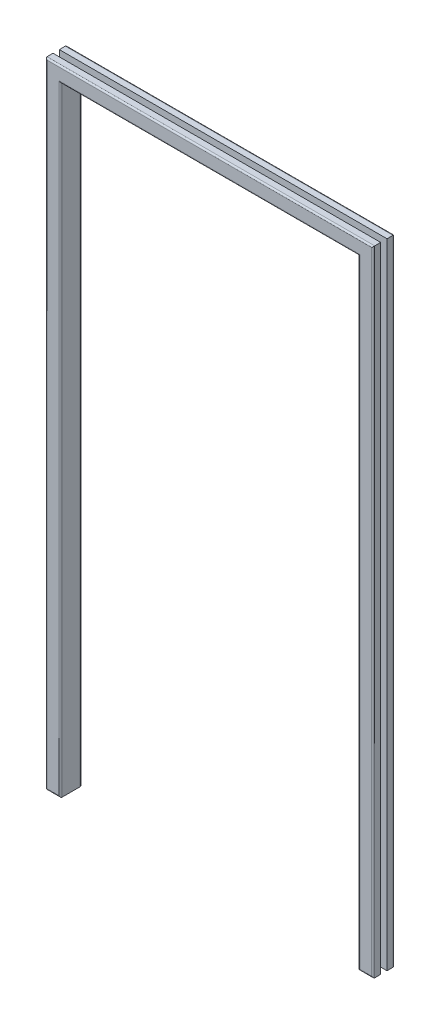
ISO-10303-21;
HEADER;
FILE_DESCRIPTION(('STEP AP214'),'2;1');
FILE_NAME('part.step','',(''),(''),'','','');
FILE_SCHEMA(('AUTOMOTIVE_DESIGN { 1 0 10303 214 1 1 1 1 }'));
ENDSEC;
DATA;
#1=APPLICATION_CONTEXT('core data for automotive mechanical design processes');
#2=APPLICATION_PROTOCOL_DEFINITION('international standard','automotive_design',2000,#1);
#3=PRODUCT_CONTEXT('',#1,'mechanical');
#4=PRODUCT('Part','Part','',(#3));
#5=PRODUCT_RELATED_PRODUCT_CATEGORY('part','',(#4));
#6=PRODUCT_DEFINITION_FORMATION('','',#4);
#7=PRODUCT_DEFINITION_CONTEXT('part definition',#1,'design');
#8=PRODUCT_DEFINITION('design','',#6,#7);
#9=PRODUCT_DEFINITION_SHAPE('','',#8);
#10=(LENGTH_UNIT() NAMED_UNIT(*) SI_UNIT(.MILLI.,.METRE.));
#11=(NAMED_UNIT(*) PLANE_ANGLE_UNIT() SI_UNIT($,.RADIAN.));
#12=(NAMED_UNIT(*) SI_UNIT($,.STERADIAN.) SOLID_ANGLE_UNIT());
#13=UNCERTAINTY_MEASURE_WITH_UNIT(LENGTH_MEASURE(1.E-05),#10,'distance_accuracy_value','');
#14=(GEOMETRIC_REPRESENTATION_CONTEXT(3) GLOBAL_UNCERTAINTY_ASSIGNED_CONTEXT((#13)) GLOBAL_UNIT_ASSIGNED_CONTEXT((#10,
#11,#12)) REPRESENTATION_CONTEXT('',''));
#15=CARTESIAN_POINT('',(0.,0.,0.));
#16=DIRECTION('',(0.,0.,1.));
#17=DIRECTION('',(1.,0.,0.));
#18=AXIS2_PLACEMENT_3D('',#15,#16,#17);
#19=CARTESIAN_POINT('',(0.,0.,25.4));
#20=DIRECTION('',(0.,1.,0.));
#21=DIRECTION('',(0.,0.,1.));
#22=AXIS2_PLACEMENT_3D('',#19,#20,#21);
#23=PLANE('',#22);
#24=DIRECTION('',(0.,0.,1.));
#25=VECTOR('',#24,1.);
#26=CARTESIAN_POINT('',(0.,0.,-46.99));
#27=LINE('',#26,#25);
#28=CARTESIAN_POINT('',(0.,0.,-41.91));
#29=VERTEX_POINT('',#28);
#30=CARTESIAN_POINT('',(0.,0.,-21.59));
#31=VERTEX_POINT('',#30);
#32=EDGE_CURVE('E220',#29,#31,#27,.T.);
#33=ORIENTED_EDGE('',*,*,#32,.F.);
#34=DIRECTION('',(-1.,0.,0.));
#35=VECTOR('',#34,1.);
#36=CARTESIAN_POINT('',(50.8,0.,-41.91));
#37=LINE('',#36,#35);
#38=CARTESIAN_POINT('',(50.7999999999998,0.,-41.91));
#39=VERTEX_POINT('',#38);
#40=EDGE_CURVE('E398',#29,#39,#37,.F.);
#41=ORIENTED_EDGE('',*,*,#40,.T.);
#42=DIRECTION('',(0.,0.,1.));
#43=VECTOR('',#42,1.);
#44=CARTESIAN_POINT('',(50.7999999999998,0.,-21.59));
#45=LINE('',#44,#43);
#46=CARTESIAN_POINT('',(50.7999999999998,0.,20.32));
#47=VERTEX_POINT('',#46);
#48=EDGE_CURVE('E302',#39,#47,#45,.T.);
#49=ORIENTED_EDGE('',*,*,#48,.T.);
#50=DIRECTION('',(1.,0.,0.));
#51=VECTOR('',#50,1.);
#52=CARTESIAN_POINT('',(0.,0.,20.32));
#53=LINE('',#52,#51);
#54=CARTESIAN_POINT('',(0.,0.,20.32));
#55=VERTEX_POINT('',#54);
#56=EDGE_CURVE('E395',#47,#55,#53,.F.);
#57=ORIENTED_EDGE('',*,*,#56,.T.);
#58=DIRECTION('',(0.,0.,-1.));
#59=VECTOR('',#58,1.);
#60=CARTESIAN_POINT('',(0.,0.,25.4));
#61=LINE('',#60,#59);
#62=CARTESIAN_POINT('',(0.,0.,0.));
#63=VERTEX_POINT('',#62);
#64=EDGE_CURVE('E340',#55,#63,#61,.T.);
#65=ORIENTED_EDGE('',*,*,#64,.T.);
#66=DIRECTION('',(1.,0.,0.));
#67=VECTOR('',#66,1.);
#68=CARTESIAN_POINT('',(0.,0.,0.));
#69=LINE('',#68,#67);
#70=CARTESIAN_POINT('',(25.3999999999997,0.,0.));
#71=VERTEX_POINT('',#70);
#72=EDGE_CURVE('E319',#63,#71,#69,.T.);
#73=ORIENTED_EDGE('',*,*,#72,.T.);
#74=DIRECTION('',(0.,0.,1.));
#75=VECTOR('',#74,1.);
#76=CARTESIAN_POINT('',(25.3999999999998,0.,-21.59));
#77=LINE('',#76,#75);
#78=CARTESIAN_POINT('',(25.3999999999998,0.,-21.59));
#79=VERTEX_POINT('',#78);
#80=EDGE_CURVE('E298',#79,#71,#77,.T.);
#81=ORIENTED_EDGE('',*,*,#80,.F.);
#82=DIRECTION('',(-1.,0.,0.));
#83=VECTOR('',#82,1.);
#84=CARTESIAN_POINT('',(1117.6,0.,-21.59));
#85=LINE('',#84,#83);
#86=EDGE_CURVE('E234',#79,#31,#85,.T.);
#87=ORIENTED_EDGE('',*,*,#86,.T.);
#88=EDGE_LOOP('',(#33,#41,#49,#57,#65,#73,#81,#87));
#89=FACE_BOUND('',#88,.T.);
#90=ADVANCED_FACE('F43',(#89),#23,.F.);
#91=CARTESIAN_POINT('',(0.,0.,0.));
#92=DIRECTION('',(0.,0.,-1.));
#93=DIRECTION('',(-1.,0.,0.));
#94=AXIS2_PLACEMENT_3D('',#91,#92,#93);
#95=PLANE('',#94);
#96=DIRECTION('',(0.,-1.,0.));
#97=VECTOR('',#96,1.);
#98=CARTESIAN_POINT('',(1092.2,0.,0.));
#99=LINE('',#98,#97);
#100=CARTESIAN_POINT('',(1092.2,2136.775,0.));
#101=VERTEX_POINT('',#100);
#102=CARTESIAN_POINT('',(1092.2,0.,0.));
#103=VERTEX_POINT('',#102);
#104=EDGE_CURVE('E268',#101,#103,#99,.T.);
#105=ORIENTED_EDGE('',*,*,#104,.F.);
#106=DIRECTION('',(1.,0.,0.));
#107=VECTOR('',#106,1.);
#108=CARTESIAN_POINT('',(1092.2,2136.775,0.));
#109=LINE('',#108,#107);
#110=CARTESIAN_POINT('',(25.3999999999996,2136.775,0.));
#111=VERTEX_POINT('',#110);
#112=EDGE_CURVE('E277',#111,#101,#109,.T.);
#113=ORIENTED_EDGE('',*,*,#112,.F.);
#114=DIRECTION('',(0.,1.,0.));
#115=VECTOR('',#114,1.);
#116=CARTESIAN_POINT('',(25.3999999999996,2136.775,0.));
#117=LINE('',#116,#115);
#118=EDGE_CURVE('E219',#71,#111,#117,.T.);
#119=ORIENTED_EDGE('',*,*,#118,.F.);
#120=ORIENTED_EDGE('',*,*,#72,.F.);
#121=DIRECTION('',(0.,-1.,0.));
#122=VECTOR('',#121,1.);
#123=CARTESIAN_POINT('',(0.,0.,0.));
#124=LINE('',#123,#122);
#125=CARTESIAN_POINT('',(-4.44089209850063E-13,2162.175,0.));
#126=VERTEX_POINT('',#125);
#127=EDGE_CURVE('E314',#126,#63,#124,.T.);
#128=ORIENTED_EDGE('',*,*,#127,.F.);
#129=DIRECTION('',(-1.,0.,0.));
#130=VECTOR('',#129,1.);
#131=CARTESIAN_POINT('',(-4.44089209850063E-13,2162.175,0.));
#132=LINE('',#131,#130);
#133=CARTESIAN_POINT('',(1117.6,2162.175,0.));
#134=VERTEX_POINT('',#133);
#135=EDGE_CURVE('E327',#134,#126,#132,.T.);
#136=ORIENTED_EDGE('',*,*,#135,.F.);
#137=DIRECTION('',(0.,1.,0.));
#138=VECTOR('',#137,1.);
#139=CARTESIAN_POINT('',(1117.6,0.,0.));
#140=LINE('',#139,#138);
#141=CARTESIAN_POINT('',(1117.6,0.,0.));
#142=VERTEX_POINT('',#141);
#143=EDGE_CURVE('E323',#142,#134,#140,.T.);
#144=ORIENTED_EDGE('',*,*,#143,.F.);
#145=EDGE_CURVE('E318',#103,#142,#69,.T.);
#146=ORIENTED_EDGE('',*,*,#145,.F.);
#147=EDGE_LOOP('',(#105,#113,#119,#120,#128,#136,#144,#146));
#148=FACE_BOUND('',#147,.T.);
#149=ADVANCED_FACE('F568',(#148),#95,.T.);
#150=CARTESIAN_POINT('',(0.,0.,25.4));
#151=DIRECTION('',(1.,0.,0.));
#152=DIRECTION('',(0.,1.,0.));
#153=AXIS2_PLACEMENT_3D('',#150,#151,#152);
#154=PLANE('',#153);
#155=ORIENTED_EDGE('',*,*,#64,.F.);
#156=DIRECTION('',(0.,-1.,0.));
#157=VECTOR('',#156,1.);
#158=CARTESIAN_POINT('',(0.,0.,20.32));
#159=LINE('',#158,#157);
#160=CARTESIAN_POINT('',(-4.44089209850063E-13,2162.175,20.32));
#161=VERTEX_POINT('',#160);
#162=EDGE_CURVE('E432',#55,#161,#159,.F.);
#163=ORIENTED_EDGE('',*,*,#162,.T.);
#164=DIRECTION('',(0.,0.,-1.));
#165=VECTOR('',#164,1.);
#166=CARTESIAN_POINT('',(-4.44089209850063E-13,2162.175,25.4));
#167=LINE('',#166,#165);
#168=EDGE_CURVE('E331',#161,#126,#167,.T.);
#169=ORIENTED_EDGE('',*,*,#168,.T.);
#170=ORIENTED_EDGE('',*,*,#127,.T.);
#171=EDGE_LOOP('',(#155,#163,#169,#170));
#172=FACE_BOUND('',#171,.T.);
#173=ADVANCED_FACE('F597',(#172),#154,.F.);
#174=DIRECTION('',(0.,0.,1.));
#175=VECTOR('',#174,1.);
#176=CARTESIAN_POINT('',(1066.8,0.,-21.59));
#177=LINE('',#176,#175);
#178=CARTESIAN_POINT('',(1066.8,0.,-41.91));
#179=VERTEX_POINT('',#178);
#180=CARTESIAN_POINT('',(1066.8,0.,20.32));
#181=VERTEX_POINT('',#180);
#182=EDGE_CURVE('E273',#179,#181,#177,.T.);
#183=ORIENTED_EDGE('',*,*,#182,.F.);
#184=DIRECTION('',(-1.,0.,0.));
#185=VECTOR('',#184,1.);
#186=CARTESIAN_POINT('',(1117.6,0.,-41.91));
#187=LINE('',#186,#185);
#188=CARTESIAN_POINT('',(1117.6,0.,-41.91));
#189=VERTEX_POINT('',#188);
#190=EDGE_CURVE('E214',#179,#189,#187,.F.);
#191=ORIENTED_EDGE('',*,*,#190,.T.);
#192=DIRECTION('',(0.,0.,1.));
#193=VECTOR('',#192,1.);
#194=CARTESIAN_POINT('',(1117.6,0.,-46.99));
#195=LINE('',#194,#193);
#196=CARTESIAN_POINT('',(1117.6,0.,-21.59));
#197=VERTEX_POINT('',#196);
#198=EDGE_CURVE('E207',#189,#197,#195,.T.);
#199=ORIENTED_EDGE('',*,*,#198,.T.);
#200=CARTESIAN_POINT('',(1092.2,0.,-21.59));
#201=VERTEX_POINT('',#200);
#202=EDGE_CURVE('E212',#197,#201,#85,.T.);
#203=ORIENTED_EDGE('',*,*,#202,.T.);
#204=DIRECTION('',(0.,0.,1.));
#205=VECTOR('',#204,1.);
#206=CARTESIAN_POINT('',(1092.2,0.,-21.59));
#207=LINE('',#206,#205);
#208=EDGE_CURVE('E287',#201,#103,#207,.T.);
#209=ORIENTED_EDGE('',*,*,#208,.T.);
#210=ORIENTED_EDGE('',*,*,#145,.T.);
#211=DIRECTION('',(0.,0.,-1.));
#212=VECTOR('',#211,1.);
#213=CARTESIAN_POINT('',(1117.6,0.,25.4));
#214=LINE('',#213,#212);
#215=CARTESIAN_POINT('',(1117.6,0.,20.32));
#216=VERTEX_POINT('',#215);
#217=EDGE_CURVE('E337',#216,#142,#214,.T.);
#218=ORIENTED_EDGE('',*,*,#217,.F.);
#219=DIRECTION('',(1.,0.,0.));
#220=VECTOR('',#219,1.);
#221=CARTESIAN_POINT('',(0.,0.,20.32));
#222=LINE('',#221,#220);
#223=EDGE_CURVE('E381',#216,#181,#222,.F.);
#224=ORIENTED_EDGE('',*,*,#223,.T.);
#225=EDGE_LOOP('',(#183,#191,#199,#203,#209,#210,#218,#224));
#226=FACE_BOUND('',#225,.T.);
#227=ADVANCED_FACE('F210',(#226),#23,.F.);
#228=CARTESIAN_POINT('',(1117.6,0.,25.4));
#229=DIRECTION('',(-1.,0.,0.));
#230=DIRECTION('',(0.,-1.,0.));
#231=AXIS2_PLACEMENT_3D('',#228,#229,#230);
#232=PLANE('',#231);
#233=DIRECTION('',(0.,0.,-1.));
#234=VECTOR('',#233,1.);
#235=CARTESIAN_POINT('',(1117.6,2162.175,25.4));
#236=LINE('',#235,#234);
#237=CARTESIAN_POINT('',(1117.6,2162.175,20.32));
#238=VERTEX_POINT('',#237);
#239=EDGE_CURVE('E334',#238,#134,#236,.T.);
#240=ORIENTED_EDGE('',*,*,#239,.F.);
#241=DIRECTION('',(0.,1.,0.));
#242=VECTOR('',#241,1.);
#243=CARTESIAN_POINT('',(1117.6,0.,20.32));
#244=LINE('',#243,#242);
#245=EDGE_CURVE('E11',#238,#216,#244,.F.);
#246=ORIENTED_EDGE('',*,*,#245,.T.);
#247=ORIENTED_EDGE('',*,*,#217,.T.);
#248=ORIENTED_EDGE('',*,*,#143,.T.);
#249=EDGE_LOOP('',(#240,#246,#247,#248));
#250=FACE_BOUND('',#249,.T.);
#251=ADVANCED_FACE('F571',(#250),#232,.F.);
#252=CARTESIAN_POINT('',(-4.44089209850063E-13,2162.175,25.4));
#253=DIRECTION('',(0.,-1.,0.));
#254=DIRECTION('',(0.,0.,-1.));
#255=AXIS2_PLACEMENT_3D('',#252,#253,#254);
#256=PLANE('',#255);
#257=ORIENTED_EDGE('',*,*,#168,.F.);
#258=DIRECTION('',(-1.,0.,0.));
#259=VECTOR('',#258,1.);
#260=CARTESIAN_POINT('',(-4.44089209850063E-13,2162.175,20.32));
#261=LINE('',#260,#259);
#262=EDGE_CURVE('E53',#161,#238,#261,.F.);
#263=ORIENTED_EDGE('',*,*,#262,.T.);
#264=ORIENTED_EDGE('',*,*,#239,.T.);
#265=ORIENTED_EDGE('',*,*,#135,.T.);
#266=EDGE_LOOP('',(#257,#263,#264,#265));
#267=FACE_BOUND('',#266,.T.);
#268=ADVANCED_FACE('F622',(#267),#256,.F.);
#269=CARTESIAN_POINT('',(0.,0.,25.4));
#270=DIRECTION('',(0.,0.,-1.));
#271=DIRECTION('',(-1.,0.,0.));
#272=AXIS2_PLACEMENT_3D('',#269,#270,#271);
#273=PLANE('',#272);
#274=DIRECTION('',(-1.,0.,0.));
#275=VECTOR('',#274,1.);
#276=CARTESIAN_POINT('',(0.,2157.095,25.4));
#277=LINE('',#276,#275);
#278=CARTESIAN_POINT('',(1112.52,2157.095,25.4));
#279=VERTEX_POINT('',#278);
#280=CARTESIAN_POINT('',(5.07999999999956,2157.095,25.4));
#281=VERTEX_POINT('',#280);
#282=EDGE_CURVE('E425',#279,#281,#277,.T.);
#283=ORIENTED_EDGE('',*,*,#282,.T.);
#284=DIRECTION('',(0.,-1.,0.));
#285=VECTOR('',#284,1.);
#286=CARTESIAN_POINT('',(5.08,0.,25.4));
#287=LINE('',#286,#285);
#288=CARTESIAN_POINT('',(5.08,5.08,25.4));
#289=VERTEX_POINT('',#288);
#290=EDGE_CURVE('E428',#281,#289,#287,.T.);
#291=ORIENTED_EDGE('',*,*,#290,.T.);
#292=DIRECTION('',(1.,0.,0.));
#293=VECTOR('',#292,1.);
#294=CARTESIAN_POINT('',(0.,5.08,25.4));
#295=LINE('',#294,#293);
#296=CARTESIAN_POINT('',(45.7199999999998,5.08,25.4));
#297=VERTEX_POINT('',#296);
#298=EDGE_CURVE('E407',#289,#297,#295,.T.);
#299=ORIENTED_EDGE('',*,*,#298,.T.);
#300=DIRECTION('',(0.,-1.,0.));
#301=VECTOR('',#300,1.);
#302=CARTESIAN_POINT('',(45.7199999999998,0.,25.4));
#303=LINE('',#302,#301);
#304=CARTESIAN_POINT('',(45.7199999999996,2116.455,25.4));
#305=VERTEX_POINT('',#304);
#306=EDGE_CURVE('E410',#297,#305,#303,.F.);
#307=ORIENTED_EDGE('',*,*,#306,.T.);
#308=DIRECTION('',(-1.,0.,0.));
#309=VECTOR('',#308,1.);
#310=CARTESIAN_POINT('',(0.,2116.455,25.4));
#311=LINE('',#310,#309);
#312=CARTESIAN_POINT('',(1071.88,2116.455,25.4));
#313=VERTEX_POINT('',#312);
#314=EDGE_CURVE('E413',#305,#313,#311,.F.);
#315=ORIENTED_EDGE('',*,*,#314,.T.);
#316=DIRECTION('',(0.,1.,0.));
#317=VECTOR('',#316,1.);
#318=CARTESIAN_POINT('',(1071.88,-1.12725200936377E-13,25.4));
#319=LINE('',#318,#317);
#320=CARTESIAN_POINT('',(1071.88,5.08,25.4));
#321=VERTEX_POINT('',#320);
#322=EDGE_CURVE('E416',#313,#321,#319,.F.);
#323=ORIENTED_EDGE('',*,*,#322,.T.);
#324=DIRECTION('',(1.,0.,0.));
#325=VECTOR('',#324,1.);
#326=CARTESIAN_POINT('',(0.,5.08,25.4));
#327=LINE('',#326,#325);
#328=CARTESIAN_POINT('',(1112.52,5.08,25.4));
#329=VERTEX_POINT('',#328);
#330=EDGE_CURVE('E419',#321,#329,#327,.T.);
#331=ORIENTED_EDGE('',*,*,#330,.T.);
#332=DIRECTION('',(0.,1.,0.));
#333=VECTOR('',#332,1.);
#334=CARTESIAN_POINT('',(1112.52,2.28500527358975E-13,25.4));
#335=LINE('',#334,#333);
#336=EDGE_CURVE('E422',#329,#279,#335,.T.);
#337=ORIENTED_EDGE('',*,*,#336,.T.);
#338=EDGE_LOOP('',(#283,#291,#299,#307,#315,#323,#331,#337));
#339=FACE_BOUND('',#338,.T.);
#340=ADVANCED_FACE('F581',(#339),#273,.F.);
#341=CARTESIAN_POINT('',(1066.8,2111.375,-21.59));
#342=DIRECTION('',(1.,0.,0.));
#343=DIRECTION('',(0.,1.,0.));
#344=AXIS2_PLACEMENT_3D('',#341,#342,#343);
#345=PLANE('',#344);
#346=DIRECTION('',(0.,0.,1.));
#347=VECTOR('',#346,1.);
#348=CARTESIAN_POINT('',(1066.8,2111.375,-21.59));
#349=LINE('',#348,#347);
#350=CARTESIAN_POINT('',(1066.8,2111.375,-41.91));
#351=VERTEX_POINT('',#350);
#352=CARTESIAN_POINT('',(1066.8,2111.375,20.32));
#353=VERTEX_POINT('',#352);
#354=EDGE_CURVE('E310',#351,#353,#349,.T.);
#355=ORIENTED_EDGE('',*,*,#354,.F.);
#356=DIRECTION('',(0.,1.,0.));
#357=VECTOR('',#356,1.);
#358=CARTESIAN_POINT('',(1066.8,0.,-41.91));
#359=LINE('',#358,#357);
#360=EDGE_CURVE('E378',#351,#179,#359,.F.);
#361=ORIENTED_EDGE('',*,*,#360,.T.);
#362=ORIENTED_EDGE('',*,*,#182,.T.);
#363=DIRECTION('',(0.,1.,0.));
#364=VECTOR('',#363,1.);
#365=CARTESIAN_POINT('',(1066.8,2111.375,20.32));
#366=LINE('',#365,#364);
#367=EDGE_CURVE('E375',#181,#353,#366,.T.);
#368=ORIENTED_EDGE('',*,*,#367,.T.);
#369=EDGE_LOOP('',(#355,#361,#362,#368));
#370=FACE_BOUND('',#369,.T.);
#371=ADVANCED_FACE('F503',(#370),#345,.F.);
#372=CARTESIAN_POINT('',(50.7999999999996,2111.375,-21.59));
#373=DIRECTION('',(0.,1.,0.));
#374=DIRECTION('',(0.,0.,1.));
#375=AXIS2_PLACEMENT_3D('',#372,#373,#374);
#376=PLANE('',#375);
#377=DIRECTION('',(0.,0.,1.));
#378=VECTOR('',#377,1.);
#379=CARTESIAN_POINT('',(50.7999999999996,2111.375,-21.59));
#380=LINE('',#379,#378);
#381=CARTESIAN_POINT('',(50.7999999999996,2111.375,-41.91));
#382=VERTEX_POINT('',#381);
#383=CARTESIAN_POINT('',(50.7999999999996,2111.375,20.32));
#384=VERTEX_POINT('',#383);
#385=EDGE_CURVE('E306',#382,#384,#380,.T.);
#386=ORIENTED_EDGE('',*,*,#385,.F.);
#387=DIRECTION('',(-1.,0.,0.));
#388=VECTOR('',#387,1.);
#389=CARTESIAN_POINT('',(1066.8,2111.375,-41.91));
#390=LINE('',#389,#388);
#391=EDGE_CURVE('E371',#382,#351,#390,.F.);
#392=ORIENTED_EDGE('',*,*,#391,.T.);
#393=ORIENTED_EDGE('',*,*,#354,.T.);
#394=DIRECTION('',(-1.,0.,0.));
#395=VECTOR('',#394,1.);
#396=CARTESIAN_POINT('',(50.7999999999996,2111.375,20.32));
#397=LINE('',#396,#395);
#398=EDGE_CURVE('E368',#353,#384,#397,.T.);
#399=ORIENTED_EDGE('',*,*,#398,.T.);
#400=EDGE_LOOP('',(#386,#392,#393,#399));
#401=FACE_BOUND('',#400,.T.);
#402=ADVANCED_FACE('F506',(#401),#376,.F.);
#403=CARTESIAN_POINT('',(50.7999999999996,2111.375,-21.59));
#404=DIRECTION('',(-1.,0.,0.));
#405=DIRECTION('',(0.,-1.,0.));
#406=AXIS2_PLACEMENT_3D('',#403,#404,#405);
#407=PLANE('',#406);
#408=ORIENTED_EDGE('',*,*,#48,.F.);
#409=DIRECTION('',(0.,-1.,0.));
#410=VECTOR('',#409,1.);
#411=CARTESIAN_POINT('',(50.7999999999996,2111.375,-41.91));
#412=LINE('',#411,#410);
#413=EDGE_CURVE('E404',#39,#382,#412,.F.);
#414=ORIENTED_EDGE('',*,*,#413,.T.);
#415=ORIENTED_EDGE('',*,*,#385,.T.);
#416=DIRECTION('',(0.,-1.,0.));
#417=VECTOR('',#416,1.);
#418=CARTESIAN_POINT('',(50.7999999999996,2111.375,20.32));
#419=LINE('',#418,#417);
#420=EDGE_CURVE('E401',#384,#47,#419,.T.);
#421=ORIENTED_EDGE('',*,*,#420,.T.);
#422=EDGE_LOOP('',(#408,#414,#415,#421));
#423=FACE_BOUND('',#422,.T.);
#424=ADVANCED_FACE('F591',(#423),#407,.F.);
#425=CARTESIAN_POINT('',(25.3999999999996,2136.775,-21.59));
#426=DIRECTION('',(1.,0.,0.));
#427=DIRECTION('',(0.,1.,0.));
#428=AXIS2_PLACEMENT_3D('',#425,#426,#427);
#429=PLANE('',#428);
#430=ORIENTED_EDGE('',*,*,#118,.T.);
#431=DIRECTION('',(0.,0.,1.));
#432=VECTOR('',#431,1.);
#433=CARTESIAN_POINT('',(25.3999999999996,2136.775,-21.59));
#434=LINE('',#433,#432);
#435=CARTESIAN_POINT('',(25.3999999999996,2136.775,-21.59));
#436=VERTEX_POINT('',#435);
#437=EDGE_CURVE('E294',#436,#111,#434,.T.);
#438=ORIENTED_EDGE('',*,*,#437,.F.);
#439=DIRECTION('',(0.,1.,0.));
#440=VECTOR('',#439,1.);
#441=CARTESIAN_POINT('',(25.3999999999996,2136.775,-21.59));
#442=LINE('',#441,#440);
#443=EDGE_CURVE('E263',#79,#436,#442,.T.);
#444=ORIENTED_EDGE('',*,*,#443,.F.);
#445=ORIENTED_EDGE('',*,*,#80,.T.);
#446=EDGE_LOOP('',(#430,#438,#444,#445));
#447=FACE_BOUND('',#446,.T.);
#448=ADVANCED_FACE('F558',(#447),#429,.F.);
#449=CARTESIAN_POINT('',(1092.2,2136.775,-21.59));
#450=DIRECTION('',(0.,-1.,0.));
#451=DIRECTION('',(0.,0.,-1.));
#452=AXIS2_PLACEMENT_3D('',#449,#450,#451);
#453=PLANE('',#452);
#454=ORIENTED_EDGE('',*,*,#112,.T.);
#455=DIRECTION('',(0.,0.,1.));
#456=VECTOR('',#455,1.);
#457=CARTESIAN_POINT('',(1092.2,2136.775,-21.59));
#458=LINE('',#457,#456);
#459=CARTESIAN_POINT('',(1092.2,2136.775,-21.59));
#460=VERTEX_POINT('',#459);
#461=EDGE_CURVE('E290',#460,#101,#458,.T.);
#462=ORIENTED_EDGE('',*,*,#461,.F.);
#463=DIRECTION('',(1.,0.,0.));
#464=VECTOR('',#463,1.);
#465=CARTESIAN_POINT('',(1092.2,2136.775,-21.59));
#466=LINE('',#465,#464);
#467=EDGE_CURVE('E267',#436,#460,#466,.T.);
#468=ORIENTED_EDGE('',*,*,#467,.F.);
#469=ORIENTED_EDGE('',*,*,#437,.T.);
#470=EDGE_LOOP('',(#454,#462,#468,#469));
#471=FACE_BOUND('',#470,.T.);
#472=ADVANCED_FACE('F560',(#471),#453,.F.);
#473=CARTESIAN_POINT('',(1092.2,0.,-21.59));
#474=DIRECTION('',(-1.,0.,0.));
#475=DIRECTION('',(0.,0.,1.));
#476=AXIS2_PLACEMENT_3D('',#473,#474,#475);
#477=PLANE('',#476);
#478=ORIENTED_EDGE('',*,*,#104,.T.);
#479=ORIENTED_EDGE('',*,*,#208,.F.);
#480=DIRECTION('',(0.,-1.,0.));
#481=VECTOR('',#480,1.);
#482=CARTESIAN_POINT('',(1092.2,0.,-21.59));
#483=LINE('',#482,#481);
#484=EDGE_CURVE('E231',#460,#201,#483,.T.);
#485=ORIENTED_EDGE('',*,*,#484,.F.);
#486=ORIENTED_EDGE('',*,*,#461,.T.);
#487=EDGE_LOOP('',(#478,#479,#485,#486));
#488=FACE_BOUND('',#487,.T.);
#489=ADVANCED_FACE('F562',(#488),#477,.F.);
#490=CARTESIAN_POINT('',(0.,0.,-21.59));
#491=DIRECTION('',(0.,0.,-1.));
#492=DIRECTION('',(-1.,0.,0.));
#493=AXIS2_PLACEMENT_3D('',#490,#491,#492);
#494=PLANE('',#493);
#495=ORIENTED_EDGE('',*,*,#86,.F.);
#496=ORIENTED_EDGE('',*,*,#443,.T.);
#497=ORIENTED_EDGE('',*,*,#467,.T.);
#498=ORIENTED_EDGE('',*,*,#484,.T.);
#499=ORIENTED_EDGE('',*,*,#202,.F.);
#500=DIRECTION('',(0.,-1.,0.));
#501=VECTOR('',#500,1.);
#502=CARTESIAN_POINT('',(1117.6,2162.175,-21.59));
#503=LINE('',#502,#501);
#504=CARTESIAN_POINT('',(1117.6,2162.175,-21.59));
#505=VERTEX_POINT('',#504);
#506=EDGE_CURVE('E228',#505,#197,#503,.T.);
#507=ORIENTED_EDGE('',*,*,#506,.F.);
#508=DIRECTION('',(1.,0.,0.));
#509=VECTOR('',#508,1.);
#510=CARTESIAN_POINT('',(1117.6,2162.175,-21.59));
#511=LINE('',#510,#509);
#512=CARTESIAN_POINT('',(0.,2162.175,-21.59));
#513=VERTEX_POINT('',#512);
#514=EDGE_CURVE('E253',#513,#505,#511,.T.);
#515=ORIENTED_EDGE('',*,*,#514,.F.);
#516=DIRECTION('',(0.,1.,0.));
#517=VECTOR('',#516,1.);
#518=CARTESIAN_POINT('',(0.,2162.175,-21.59));
#519=LINE('',#518,#517);
#520=EDGE_CURVE('E233',#31,#513,#519,.T.);
#521=ORIENTED_EDGE('',*,*,#520,.F.);
#522=EDGE_LOOP('',(#495,#496,#497,#498,#499,#507,#515,#521));
#523=FACE_BOUND('',#522,.T.);
#524=ADVANCED_FACE('F226',(#523),#494,.F.);
#525=CARTESIAN_POINT('',(1117.6,2162.175,-46.99));
#526=DIRECTION('',(-1.,0.,0.));
#527=DIRECTION('',(0.,-1.,0.));
#528=AXIS2_PLACEMENT_3D('',#525,#526,#527);
#529=PLANE('',#528);
#530=ORIENTED_EDGE('',*,*,#198,.F.);
#531=DIRECTION('',(0.,-1.,0.));
#532=VECTOR('',#531,1.);
#533=CARTESIAN_POINT('',(1117.6,2162.175,-41.91));
#534=LINE('',#533,#532);
#535=CARTESIAN_POINT('',(1117.6,2162.175,-41.91));
#536=VERTEX_POINT('',#535);
#537=EDGE_CURVE('E386',#189,#536,#534,.F.);
#538=ORIENTED_EDGE('',*,*,#537,.T.);
#539=DIRECTION('',(0.,0.,1.));
#540=VECTOR('',#539,1.);
#541=CARTESIAN_POINT('',(1117.6,2162.175,-46.99));
#542=LINE('',#541,#540);
#543=EDGE_CURVE('E238',#536,#505,#542,.T.);
#544=ORIENTED_EDGE('',*,*,#543,.T.);
#545=ORIENTED_EDGE('',*,*,#506,.T.);
#546=EDGE_LOOP('',(#530,#538,#544,#545));
#547=FACE_BOUND('',#546,.T.);
#548=ADVANCED_FACE('F236',(#547),#529,.F.);
#549=CARTESIAN_POINT('',(0.,2162.175,-46.99));
#550=DIRECTION('',(1.,0.,0.));
#551=DIRECTION('',(0.,0.,-1.));
#552=AXIS2_PLACEMENT_3D('',#549,#550,#551);
#553=PLANE('',#552);
#554=DIRECTION('',(0.,0.,1.));
#555=VECTOR('',#554,1.);
#556=CARTESIAN_POINT('',(0.,2162.175,-46.99));
#557=LINE('',#556,#555);
#558=CARTESIAN_POINT('',(0.,2162.175,-41.91));
#559=VERTEX_POINT('',#558);
#560=EDGE_CURVE('E258',#559,#513,#557,.T.);
#561=ORIENTED_EDGE('',*,*,#560,.F.);
#562=DIRECTION('',(0.,1.,0.));
#563=VECTOR('',#562,1.);
#564=CARTESIAN_POINT('',(0.,0.,-41.91));
#565=LINE('',#564,#563);
#566=EDGE_CURVE('E392',#559,#29,#565,.F.);
#567=ORIENTED_EDGE('',*,*,#566,.T.);
#568=ORIENTED_EDGE('',*,*,#32,.T.);
#569=ORIENTED_EDGE('',*,*,#520,.T.);
#570=EDGE_LOOP('',(#561,#567,#568,#569));
#571=FACE_BOUND('',#570,.T.);
#572=ADVANCED_FACE('F551',(#571),#553,.F.);
#573=CARTESIAN_POINT('',(1117.6,2162.175,-46.99));
#574=DIRECTION('',(0.,-1.,0.));
#575=DIRECTION('',(0.,0.,-1.));
#576=AXIS2_PLACEMENT_3D('',#573,#574,#575);
#577=PLANE('',#576);
#578=ORIENTED_EDGE('',*,*,#543,.F.);
#579=DIRECTION('',(1.,0.,0.));
#580=VECTOR('',#579,1.);
#581=CARTESIAN_POINT('',(0.,2162.175,-41.91));
#582=LINE('',#581,#580);
#583=EDGE_CURVE('E389',#536,#559,#582,.F.);
#584=ORIENTED_EDGE('',*,*,#583,.T.);
#585=ORIENTED_EDGE('',*,*,#560,.T.);
#586=ORIENTED_EDGE('',*,*,#514,.T.);
#587=EDGE_LOOP('',(#578,#584,#585,#586));
#588=FACE_BOUND('',#587,.T.);
#589=ADVANCED_FACE('F537',(#588),#577,.F.);
#590=CARTESIAN_POINT('',(0.,0.,-46.99));
#591=DIRECTION('',(0.,0.,-1.));
#592=DIRECTION('',(-1.,0.,0.));
#593=AXIS2_PLACEMENT_3D('',#590,#591,#592);
#594=PLANE('',#593);
#595=DIRECTION('',(0.,1.,0.));
#596=VECTOR('',#595,1.);
#597=CARTESIAN_POINT('',(1071.88,2111.375,-46.99));
#598=LINE('',#597,#596);
#599=CARTESIAN_POINT('',(1071.88,5.08,-46.99));
#600=VERTEX_POINT('',#599);
#601=CARTESIAN_POINT('',(1071.88,2116.455,-46.99));
#602=VERTEX_POINT('',#601);
#603=EDGE_CURVE('E361',#600,#602,#598,.T.);
#604=ORIENTED_EDGE('',*,*,#603,.T.);
#605=DIRECTION('',(-1.,0.,0.));
#606=VECTOR('',#605,1.);
#607=CARTESIAN_POINT('',(50.8,2116.455,-46.99));
#608=LINE('',#607,#606);
#609=CARTESIAN_POINT('',(45.7199999999996,2116.455,-46.99));
#610=VERTEX_POINT('',#609);
#611=EDGE_CURVE('E364',#602,#610,#608,.T.);
#612=ORIENTED_EDGE('',*,*,#611,.T.);
#613=DIRECTION('',(0.,-1.,0.));
#614=VECTOR('',#613,1.);
#615=CARTESIAN_POINT('',(45.7199999999998,0.,-46.99));
#616=LINE('',#615,#614);
#617=CARTESIAN_POINT('',(45.7199999999998,5.08,-46.99));
#618=VERTEX_POINT('',#617);
#619=EDGE_CURVE('E343',#610,#618,#616,.T.);
#620=ORIENTED_EDGE('',*,*,#619,.T.);
#621=DIRECTION('',(-1.,0.,0.));
#622=VECTOR('',#621,1.);
#623=CARTESIAN_POINT('',(0.,5.08,-46.99));
#624=LINE('',#623,#622);
#625=CARTESIAN_POINT('',(5.08,5.08,-46.99));
#626=VERTEX_POINT('',#625);
#627=EDGE_CURVE('E346',#618,#626,#624,.T.);
#628=ORIENTED_EDGE('',*,*,#627,.T.);
#629=DIRECTION('',(0.,1.,0.));
#630=VECTOR('',#629,1.);
#631=CARTESIAN_POINT('',(5.08,2162.175,-46.99));
#632=LINE('',#631,#630);
#633=CARTESIAN_POINT('',(5.08,2157.095,-46.99));
#634=VERTEX_POINT('',#633);
#635=EDGE_CURVE('E349',#626,#634,#632,.T.);
#636=ORIENTED_EDGE('',*,*,#635,.T.);
#637=DIRECTION('',(1.,0.,0.));
#638=VECTOR('',#637,1.);
#639=CARTESIAN_POINT('',(1117.6,2157.095,-46.99));
#640=LINE('',#639,#638);
#641=CARTESIAN_POINT('',(1112.52,2157.095,-46.99));
#642=VERTEX_POINT('',#641);
#643=EDGE_CURVE('E352',#634,#642,#640,.T.);
#644=ORIENTED_EDGE('',*,*,#643,.T.);
#645=DIRECTION('',(0.,-1.,0.));
#646=VECTOR('',#645,1.);
#647=CARTESIAN_POINT('',(1112.52,0.,-46.99));
#648=LINE('',#647,#646);
#649=CARTESIAN_POINT('',(1112.52,5.08,-46.99));
#650=VERTEX_POINT('',#649);
#651=EDGE_CURVE('E355',#642,#650,#648,.T.);
#652=ORIENTED_EDGE('',*,*,#651,.T.);
#653=DIRECTION('',(-1.,0.,0.));
#654=VECTOR('',#653,1.);
#655=CARTESIAN_POINT('',(1066.8,5.08,-46.99));
#656=LINE('',#655,#654);
#657=EDGE_CURVE('E358',#650,#600,#656,.T.);
#658=ORIENTED_EDGE('',*,*,#657,.T.);
#659=EDGE_LOOP('',(#604,#612,#620,#628,#636,#644,#652,#658));
#660=FACE_BOUND('',#659,.T.);
#661=ADVANCED_FACE('F521',(#660),#594,.T.);
#662=CARTESIAN_POINT('',(0.,2157.095,-41.91));
#663=DIRECTION('',(-1.,0.,0.));
#664=DIRECTION('',(0.,0.,1.));
#665=AXIS2_PLACEMENT_3D('',#662,#663,#664);
#666=CYLINDRICAL_SURFACE('',#665,5.08);
#667=CARTESIAN_POINT('',(5.08,2157.095,-41.91));
#668=DIRECTION('',(-0.707106781186547,-0.707106781186547,0.));
#669=DIRECTION('',(0.707106781186547,-0.707106781186547,0.));
#670=AXIS2_PLACEMENT_3D('',#667,#668,#669);
#671=ELLIPSE('',#670,7.18420489685532,5.08);
#672=EDGE_CURVE('E247',#559,#634,#671,.T.);
#673=ORIENTED_EDGE('',*,*,#672,.F.);
#674=ORIENTED_EDGE('',*,*,#583,.F.);
#675=CARTESIAN_POINT('',(1112.52,2157.095,-41.91));
#676=DIRECTION('',(-0.707106781186547,0.707106781186548,0.));
#677=DIRECTION('',(-0.707106781186547,-0.707106781186547,0.));
#678=AXIS2_PLACEMENT_3D('',#675,#676,#677);
#679=ELLIPSE('',#678,7.18420489685532,5.08);
#680=EDGE_CURVE('E241',#642,#536,#679,.F.);
#681=ORIENTED_EDGE('',*,*,#680,.F.);
#682=ORIENTED_EDGE('',*,*,#643,.F.);
#683=EDGE_LOOP('',(#673,#674,#681,#682));
#684=FACE_BOUND('',#683,.T.);
#685=ADVANCED_FACE('F541',(#684),#666,.T.);
#686=CARTESIAN_POINT('',(1112.52,-1.14250263679487E-13,-41.91));
#687=DIRECTION('',(0.,1.,0.));
#688=DIRECTION('',(-1.,0.,0.));
#689=AXIS2_PLACEMENT_3D('',#686,#687,#688);
#690=CYLINDRICAL_SURFACE('',#689,5.08);
#691=ORIENTED_EDGE('',*,*,#680,.T.);
#692=ORIENTED_EDGE('',*,*,#537,.F.);
#693=CARTESIAN_POINT('',(1112.52,5.08,-41.91));
#694=DIRECTION('',(0.707106781186547,0.707106781186547,0.));
#695=DIRECTION('',(-0.707106781186547,0.707106781186548,0.));
#696=AXIS2_PLACEMENT_3D('',#693,#694,#695);
#697=ELLIPSE('',#696,7.18420489685532,5.08);
#698=EDGE_CURVE('E456',#650,#189,#697,.F.);
#699=ORIENTED_EDGE('',*,*,#698,.F.);
#700=ORIENTED_EDGE('',*,*,#651,.F.);
#701=EDGE_LOOP('',(#691,#692,#699,#700));
#702=FACE_BOUND('',#701,.T.);
#703=ADVANCED_FACE('F533',(#702),#690,.T.);
#704=CARTESIAN_POINT('',(5.08,0.,-41.91));
#705=DIRECTION('',(0.,-1.,0.));
#706=DIRECTION('',(0.,0.,-1.));
#707=AXIS2_PLACEMENT_3D('',#704,#705,#706);
#708=CYLINDRICAL_SURFACE('',#707,5.08);
#709=ORIENTED_EDGE('',*,*,#672,.T.);
#710=ORIENTED_EDGE('',*,*,#635,.F.);
#711=CARTESIAN_POINT('',(5.08,5.08,-41.91));
#712=DIRECTION('',(0.707106781186547,-0.707106781186547,0.));
#713=DIRECTION('',(0.707106781186547,0.707106781186547,0.));
#714=AXIS2_PLACEMENT_3D('',#711,#712,#713);
#715=ELLIPSE('',#714,7.18420489685532,5.08);
#716=EDGE_CURVE('E452',#29,#626,#715,.T.);
#717=ORIENTED_EDGE('',*,*,#716,.F.);
#718=ORIENTED_EDGE('',*,*,#566,.F.);
#719=EDGE_LOOP('',(#709,#710,#717,#718));
#720=FACE_BOUND('',#719,.T.);
#721=ADVANCED_FACE('F547',(#720),#708,.T.);
#722=CARTESIAN_POINT('',(0.,5.08,-41.91));
#723=DIRECTION('',(1.,0.,0.));
#724=DIRECTION('',(0.,0.,-1.));
#725=AXIS2_PLACEMENT_3D('',#722,#723,#724);
#726=CYLINDRICAL_SURFACE('',#725,5.08);
#727=ORIENTED_EDGE('',*,*,#698,.T.);
#728=ORIENTED_EDGE('',*,*,#190,.F.);
#729=CARTESIAN_POINT('',(1071.88,5.08,-41.91));
#730=DIRECTION('',(0.707106781186547,-0.707106781186548,0.));
#731=DIRECTION('',(0.707106781186547,0.707106781186547,0.));
#732=AXIS2_PLACEMENT_3D('',#729,#730,#731);
#733=ELLIPSE('',#732,7.18420489685532,5.08);
#734=EDGE_CURVE('E448',#600,#179,#733,.F.);
#735=ORIENTED_EDGE('',*,*,#734,.F.);
#736=ORIENTED_EDGE('',*,*,#657,.F.);
#737=EDGE_LOOP('',(#727,#728,#735,#736));
#738=FACE_BOUND('',#737,.T.);
#739=ADVANCED_FACE('F529',(#738),#726,.T.);
#740=CARTESIAN_POINT('',(0.,5.08,-41.91));
#741=DIRECTION('',(1.,0.,0.));
#742=DIRECTION('',(0.,0.,-1.));
#743=AXIS2_PLACEMENT_3D('',#740,#741,#742);
#744=CYLINDRICAL_SURFACE('',#743,5.08);
#745=ORIENTED_EDGE('',*,*,#716,.T.);
#746=ORIENTED_EDGE('',*,*,#627,.F.);
#747=CARTESIAN_POINT('',(45.7199999999998,5.08,-41.91));
#748=DIRECTION('',(0.707106781186547,0.707106781186548,0.));
#749=DIRECTION('',(-0.707106781186547,0.707106781186547,0.));
#750=AXIS2_PLACEMENT_3D('',#747,#748,#749);
#751=ELLIPSE('',#750,7.18420489685532,5.08);
#752=EDGE_CURVE('E444',#39,#618,#751,.T.);
#753=ORIENTED_EDGE('',*,*,#752,.F.);
#754=ORIENTED_EDGE('',*,*,#40,.F.);
#755=EDGE_LOOP('',(#745,#746,#753,#754));
#756=FACE_BOUND('',#755,.T.);
#757=ADVANCED_FACE('F632',(#756),#744,.T.);
#758=CARTESIAN_POINT('',(1071.88,-1.12725200936377E-13,-41.91));
#759=DIRECTION('',(0.,-1.,0.));
#760=DIRECTION('',(1.,0.,0.));
#761=AXIS2_PLACEMENT_3D('',#758,#759,#760);
#762=CYLINDRICAL_SURFACE('',#761,5.08);
#763=ORIENTED_EDGE('',*,*,#734,.T.);
#764=ORIENTED_EDGE('',*,*,#360,.F.);
#765=CARTESIAN_POINT('',(1071.88,2116.455,-41.91));
#766=DIRECTION('',(0.707106781186547,-0.707106781186548,0.));
#767=DIRECTION('',(0.707106781186547,0.707106781186547,0.));
#768=AXIS2_PLACEMENT_3D('',#765,#766,#767);
#769=ELLIPSE('',#768,7.18420489685532,5.08);
#770=EDGE_CURVE('E441',#602,#351,#769,.F.);
#771=ORIENTED_EDGE('',*,*,#770,.F.);
#772=ORIENTED_EDGE('',*,*,#603,.F.);
#773=EDGE_LOOP('',(#763,#764,#771,#772));
#774=FACE_BOUND('',#773,.T.);
#775=ADVANCED_FACE('F526',(#774),#762,.T.);
#776=CARTESIAN_POINT('',(45.7199999999998,0.,-41.91));
#777=DIRECTION('',(0.,1.,0.));
#778=DIRECTION('',(-1.,0.,0.));
#779=AXIS2_PLACEMENT_3D('',#776,#777,#778);
#780=CYLINDRICAL_SURFACE('',#779,5.08);
#781=ORIENTED_EDGE('',*,*,#752,.T.);
#782=ORIENTED_EDGE('',*,*,#619,.F.);
#783=CARTESIAN_POINT('',(45.7199999999996,2116.455,-41.91));
#784=DIRECTION('',(0.707106781186547,0.707106781186548,0.));
#785=DIRECTION('',(0.707106781186547,-0.707106781186547,0.));
#786=AXIS2_PLACEMENT_3D('',#783,#784,#785);
#787=ELLIPSE('',#786,7.18420489685532,5.08);
#788=EDGE_CURVE('E438',#382,#610,#787,.T.);
#789=ORIENTED_EDGE('',*,*,#788,.F.);
#790=ORIENTED_EDGE('',*,*,#413,.F.);
#791=EDGE_LOOP('',(#781,#782,#789,#790));
#792=FACE_BOUND('',#791,.T.);
#793=ADVANCED_FACE('F517',(#792),#780,.T.);
#794=CARTESIAN_POINT('',(0.,2116.455,-41.91));
#795=DIRECTION('',(1.,0.,0.));
#796=DIRECTION('',(0.,0.,-1.));
#797=AXIS2_PLACEMENT_3D('',#794,#795,#796);
#798=CYLINDRICAL_SURFACE('',#797,5.08);
#799=ORIENTED_EDGE('',*,*,#770,.T.);
#800=ORIENTED_EDGE('',*,*,#391,.F.);
#801=ORIENTED_EDGE('',*,*,#788,.T.);
#802=ORIENTED_EDGE('',*,*,#611,.F.);
#803=EDGE_LOOP('',(#799,#800,#801,#802));
#804=FACE_BOUND('',#803,.T.);
#805=ADVANCED_FACE('F510',(#804),#798,.T.);
#806=CARTESIAN_POINT('',(1071.88,2111.375,20.32));
#807=DIRECTION('',(0.,1.,0.));
#808=DIRECTION('',(-1.,0.,0.));
#809=AXIS2_PLACEMENT_3D('',#806,#807,#808);
#810=CYLINDRICAL_SURFACE('',#809,5.08);
#811=CARTESIAN_POINT('',(1071.88,2116.455,20.32));
#812=DIRECTION('',(-0.707106781186547,0.707106781186548,0.));
#813=DIRECTION('',(0.707106781186547,0.707106781186547,0.));
#814=AXIS2_PLACEMENT_3D('',#811,#812,#813);
#815=ELLIPSE('',#814,7.18420489685532,5.08);
#816=EDGE_CURVE('E483',#353,#313,#815,.T.);
#817=ORIENTED_EDGE('',*,*,#816,.F.);
#818=ORIENTED_EDGE('',*,*,#367,.F.);
#819=CARTESIAN_POINT('',(1071.88,5.07999999999999,20.32));
#820=DIRECTION('',(-0.707106781186547,0.707106781186548,0.));
#821=DIRECTION('',(0.707106781186547,0.707106781186547,0.));
#822=AXIS2_PLACEMENT_3D('',#819,#820,#821);
#823=ELLIPSE('',#822,7.18420489685532,5.08);
#824=EDGE_CURVE('E47',#321,#181,#823,.F.);
#825=ORIENTED_EDGE('',*,*,#824,.F.);
#826=ORIENTED_EDGE('',*,*,#322,.F.);
#827=EDGE_LOOP('',(#817,#818,#825,#826));
#828=FACE_BOUND('',#827,.T.);
#829=ADVANCED_FACE('F45',(#828),#810,.T.);
#830=CARTESIAN_POINT('',(0.,5.08,20.32));
#831=DIRECTION('',(1.,0.,0.));
#832=DIRECTION('',(0.,0.,-1.));
#833=AXIS2_PLACEMENT_3D('',#830,#831,#832);
#834=CYLINDRICAL_SURFACE('',#833,5.08);
#835=ORIENTED_EDGE('',*,*,#824,.T.);
#836=ORIENTED_EDGE('',*,*,#223,.F.);
#837=CARTESIAN_POINT('',(1112.52,5.08,20.32));
#838=DIRECTION('',(0.707106781186547,0.707106781186548,0.));
#839=DIRECTION('',(0.707106781186548,-0.707106781186547,0.));
#840=AXIS2_PLACEMENT_3D('',#837,#838,#839);
#841=ELLIPSE('',#840,7.18420489685532,5.08);
#842=EDGE_CURVE('E480',#329,#216,#841,.T.);
#843=ORIENTED_EDGE('',*,*,#842,.F.);
#844=ORIENTED_EDGE('',*,*,#330,.F.);
#845=EDGE_LOOP('',(#835,#836,#843,#844));
#846=FACE_BOUND('',#845,.T.);
#847=ADVANCED_FACE('F496',(#846),#834,.T.);
#848=CARTESIAN_POINT('',(50.7999999999996,2116.455,20.32));
#849=DIRECTION('',(-1.,0.,0.));
#850=DIRECTION('',(0.,0.,1.));
#851=AXIS2_PLACEMENT_3D('',#848,#849,#850);
#852=CYLINDRICAL_SURFACE('',#851,5.08);
#853=ORIENTED_EDGE('',*,*,#816,.T.);
#854=ORIENTED_EDGE('',*,*,#314,.F.);
#855=CARTESIAN_POINT('',(45.7199999999996,2116.455,20.32));
#856=DIRECTION('',(-0.707106781186547,-0.707106781186548,0.));
#857=DIRECTION('',(-0.707106781186547,0.707106781186547,0.));
#858=AXIS2_PLACEMENT_3D('',#855,#856,#857);
#859=ELLIPSE('',#858,7.18420489685532,5.08);
#860=EDGE_CURVE('E476',#384,#305,#859,.T.);
#861=ORIENTED_EDGE('',*,*,#860,.F.);
#862=ORIENTED_EDGE('',*,*,#398,.F.);
#863=EDGE_LOOP('',(#853,#854,#861,#862));
#864=FACE_BOUND('',#863,.T.);
#865=ADVANCED_FACE('F584',(#864),#852,.T.);
#866=CARTESIAN_POINT('',(1112.52,2.28500527358975E-13,20.32));
#867=DIRECTION('',(0.,1.,0.));
#868=DIRECTION('',(-1.,0.,0.));
#869=AXIS2_PLACEMENT_3D('',#866,#867,#868);
#870=CYLINDRICAL_SURFACE('',#869,5.08);
#871=ORIENTED_EDGE('',*,*,#842,.T.);
#872=ORIENTED_EDGE('',*,*,#245,.F.);
#873=CARTESIAN_POINT('',(1112.52,2157.095,20.32));
#874=DIRECTION('',(-0.707106781186548,0.707106781186547,0.));
#875=DIRECTION('',(0.707106781186547,0.707106781186548,0.));
#876=AXIS2_PLACEMENT_3D('',#873,#874,#875);
#877=ELLIPSE('',#876,7.18420489685532,5.08);
#878=EDGE_CURVE('E472',#279,#238,#877,.T.);
#879=ORIENTED_EDGE('',*,*,#878,.F.);
#880=ORIENTED_EDGE('',*,*,#336,.F.);
#881=EDGE_LOOP('',(#871,#872,#879,#880));
#882=FACE_BOUND('',#881,.T.);
#883=ADVANCED_FACE('F575',(#882),#870,.T.);
#884=CARTESIAN_POINT('',(45.7199999999996,2111.375,20.32));
#885=DIRECTION('',(0.,-1.,0.));
#886=DIRECTION('',(1.,0.,0.));
#887=AXIS2_PLACEMENT_3D('',#884,#885,#886);
#888=CYLINDRICAL_SURFACE('',#887,5.08);
#889=ORIENTED_EDGE('',*,*,#860,.T.);
#890=ORIENTED_EDGE('',*,*,#306,.F.);
#891=CARTESIAN_POINT('',(45.7199999999998,5.07999999999999,20.32));
#892=DIRECTION('',(0.707106781186547,0.707106781186548,0.));
#893=DIRECTION('',(0.707106781186547,-0.707106781186547,0.));
#894=AXIS2_PLACEMENT_3D('',#891,#892,#893);
#895=ELLIPSE('',#894,7.18420489685532,5.08);
#896=EDGE_CURVE('E468',#47,#297,#895,.F.);
#897=ORIENTED_EDGE('',*,*,#896,.F.);
#898=ORIENTED_EDGE('',*,*,#420,.F.);
#899=EDGE_LOOP('',(#889,#890,#897,#898));
#900=FACE_BOUND('',#899,.T.);
#901=ADVANCED_FACE('F587',(#900),#888,.T.);
#902=CARTESIAN_POINT('',(0.,2157.095,20.32));
#903=DIRECTION('',(-1.,0.,0.));
#904=DIRECTION('',(0.,0.,1.));
#905=AXIS2_PLACEMENT_3D('',#902,#903,#904);
#906=CYLINDRICAL_SURFACE('',#905,5.08);
#907=ORIENTED_EDGE('',*,*,#878,.T.);
#908=ORIENTED_EDGE('',*,*,#262,.F.);
#909=CARTESIAN_POINT('',(5.07999999999956,2157.095,20.32));
#910=DIRECTION('',(-0.707106781186547,-0.707106781186548,0.));
#911=DIRECTION('',(-0.707106781186548,0.707106781186547,0.));
#912=AXIS2_PLACEMENT_3D('',#909,#910,#911);
#913=ELLIPSE('',#912,7.18420489685532,5.08);
#914=EDGE_CURVE('E68',#281,#161,#913,.T.);
#915=ORIENTED_EDGE('',*,*,#914,.F.);
#916=ORIENTED_EDGE('',*,*,#282,.F.);
#917=EDGE_LOOP('',(#907,#908,#915,#916));
#918=FACE_BOUND('',#917,.T.);
#919=ADVANCED_FACE('F579',(#918),#906,.T.);
#920=CARTESIAN_POINT('',(0.,5.08,20.32));
#921=DIRECTION('',(1.,0.,0.));
#922=DIRECTION('',(0.,0.,-1.));
#923=AXIS2_PLACEMENT_3D('',#920,#921,#922);
#924=CYLINDRICAL_SURFACE('',#923,5.08);
#925=ORIENTED_EDGE('',*,*,#896,.T.);
#926=ORIENTED_EDGE('',*,*,#298,.F.);
#927=CARTESIAN_POINT('',(5.08,5.08,20.32));
#928=DIRECTION('',(0.707106781186548,-0.707106781186547,0.));
#929=DIRECTION('',(0.707106781186547,0.707106781186548,0.));
#930=AXIS2_PLACEMENT_3D('',#927,#928,#929);
#931=ELLIPSE('',#930,7.18420489685532,5.08);
#932=EDGE_CURVE('E463',#55,#289,#931,.F.);
#933=ORIENTED_EDGE('',*,*,#932,.F.);
#934=ORIENTED_EDGE('',*,*,#56,.F.);
#935=EDGE_LOOP('',(#925,#926,#933,#934));
#936=FACE_BOUND('',#935,.T.);
#937=ADVANCED_FACE('F600',(#936),#924,.T.);
#938=CARTESIAN_POINT('',(5.08,0.,20.32));
#939=DIRECTION('',(0.,-1.,0.));
#940=DIRECTION('',(1.,0.,0.));
#941=AXIS2_PLACEMENT_3D('',#938,#939,#940);
#942=CYLINDRICAL_SURFACE('',#941,5.08);
#943=ORIENTED_EDGE('',*,*,#914,.T.);
#944=ORIENTED_EDGE('',*,*,#162,.F.);
#945=ORIENTED_EDGE('',*,*,#932,.T.);
#946=ORIENTED_EDGE('',*,*,#290,.F.);
#947=EDGE_LOOP('',(#943,#944,#945,#946));
#948=FACE_BOUND('',#947,.T.);
#949=ADVANCED_FACE('F598',(#948),#942,.T.);
#950=CLOSED_SHELL('',(#90,#149,#173,#227,#251,#268,#340,#371,#402,#424,#448,#472,#489,#524,#548,
#572,#589,#661,#685,#703,#721,#739,#757,#775,#793,#805,#829,#847,#865,#883,#901,#919,#937,#949));
#951=MANIFOLD_SOLID_BREP('B2',#950);
#952=ADVANCED_BREP_SHAPE_REPRESENTATION('',(#18,#951),#14);
#953=SHAPE_DEFINITION_REPRESENTATION(#9,#952);
ENDSEC;
END-ISO-10303-21;
